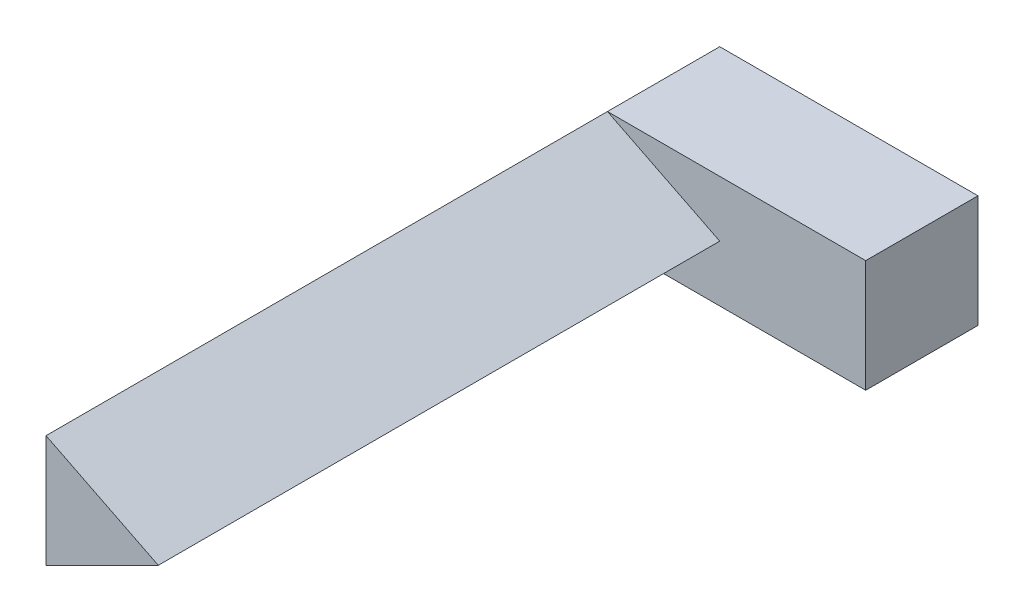
ISO-10303-21;
HEADER;
FILE_DESCRIPTION(('STEP AP214'),'2;1');
FILE_NAME('part.step','',(''),(''),'','','');
FILE_SCHEMA(('AUTOMOTIVE_DESIGN { 1 0 10303 214 1 1 1 1 }'));
ENDSEC;
DATA;
#1=APPLICATION_CONTEXT('core data for automotive mechanical design processes');
#2=APPLICATION_PROTOCOL_DEFINITION('international standard','automotive_design',2000,#1);
#3=PRODUCT_CONTEXT('',#1,'mechanical');
#4=PRODUCT('Part','Part','',(#3));
#5=PRODUCT_RELATED_PRODUCT_CATEGORY('part','',(#4));
#6=PRODUCT_DEFINITION_FORMATION('','',#4);
#7=PRODUCT_DEFINITION_CONTEXT('part definition',#1,'design');
#8=PRODUCT_DEFINITION('design','',#6,#7);
#9=PRODUCT_DEFINITION_SHAPE('','',#8);
#10=(LENGTH_UNIT() NAMED_UNIT(*) SI_UNIT(.MILLI.,.METRE.));
#11=(NAMED_UNIT(*) PLANE_ANGLE_UNIT() SI_UNIT($,.RADIAN.));
#12=(NAMED_UNIT(*) SI_UNIT($,.STERADIAN.) SOLID_ANGLE_UNIT());
#13=UNCERTAINTY_MEASURE_WITH_UNIT(LENGTH_MEASURE(1.E-05),#10,'distance_accuracy_value','');
#14=(GEOMETRIC_REPRESENTATION_CONTEXT(3) GLOBAL_UNCERTAINTY_ASSIGNED_CONTEXT((#13)) GLOBAL_UNIT_ASSIGNED_CONTEXT((#10,
#11,#12)) REPRESENTATION_CONTEXT('',''));
#15=CARTESIAN_POINT('',(0.,0.,0.));
#16=DIRECTION('',(0.,0.,1.));
#17=DIRECTION('',(1.,0.,0.));
#18=AXIS2_PLACEMENT_3D('',#15,#16,#17);
#19=CARTESIAN_POINT('',(0.,5.,0.));
#20=DIRECTION('',(-1.,0.,0.));
#21=DIRECTION('',(0.,0.,1.));
#22=AXIS2_PLACEMENT_3D('',#19,#20,#21);
#23=PLANE('',#22);
#24=DIRECTION('',(0.,0.,-1.));
#25=VECTOR('',#24,1.);
#26=CARTESIAN_POINT('',(0.,-5.,0.));
#27=LINE('',#26,#25);
#28=CARTESIAN_POINT('',(0.,-5.,10.));
#29=VERTEX_POINT('',#28);
#30=CARTESIAN_POINT('',(0.,-5.,0.));
#31=VERTEX_POINT('',#30);
#32=EDGE_CURVE('E103',#29,#31,#27,.T.);
#33=ORIENTED_EDGE('',*,*,#32,.T.);
#34=DIRECTION('',(0.,-1.,0.));
#35=VECTOR('',#34,1.);
#36=CARTESIAN_POINT('',(0.,5.,0.));
#37=LINE('',#36,#35);
#38=CARTESIAN_POINT('',(0.,5.,0.));
#39=VERTEX_POINT('',#38);
#40=EDGE_CURVE('E11',#39,#31,#37,.T.);
#41=ORIENTED_EDGE('',*,*,#40,.F.);
#42=DIRECTION('',(0.,0.,-1.));
#43=VECTOR('',#42,1.);
#44=CARTESIAN_POINT('',(0.,5.,0.));
#45=LINE('',#44,#43);
#46=CARTESIAN_POINT('',(0.,5.,10.));
#47=VERTEX_POINT('',#46);
#48=EDGE_CURVE('E105',#47,#39,#45,.T.);
#49=ORIENTED_EDGE('',*,*,#48,.F.);
#50=DIRECTION('',(0.,-1.,0.));
#51=VECTOR('',#50,1.);
#52=CARTESIAN_POINT('',(0.,5.,10.));
#53=LINE('',#52,#51);
#54=EDGE_CURVE('E135',#47,#29,#53,.T.);
#55=ORIENTED_EDGE('',*,*,#54,.T.);
#56=EDGE_LOOP('',(#33,#41,#49,#55));
#57=FACE_BOUND('',#56,.T.);
#58=ADVANCED_FACE('F39',(#57),#23,.F.);
#59=CARTESIAN_POINT('',(0.,5.,0.));
#60=DIRECTION('',(0.,0.,1.));
#61=DIRECTION('',(1.,0.,0.));
#62=AXIS2_PLACEMENT_3D('',#59,#60,#61);
#63=PLANE('',#62);
#64=DIRECTION('',(-1.,0.,0.));
#65=VECTOR('',#64,1.);
#66=CARTESIAN_POINT('',(0.,-5.,0.));
#67=LINE('',#66,#65);
#68=CARTESIAN_POINT('',(-23.,-5.,0.));
#69=VERTEX_POINT('',#68);
#70=EDGE_CURVE('E129',#31,#69,#67,.T.);
#71=ORIENTED_EDGE('',*,*,#70,.T.);
#72=DIRECTION('',(0.,-1.,0.));
#73=VECTOR('',#72,1.);
#74=CARTESIAN_POINT('',(-23.,5.,0.));
#75=LINE('',#74,#73);
#76=CARTESIAN_POINT('',(-23.,5.,0.));
#77=VERTEX_POINT('',#76);
#78=EDGE_CURVE('E47',#77,#69,#75,.T.);
#79=ORIENTED_EDGE('',*,*,#78,.F.);
#80=DIRECTION('',(-1.,0.,0.));
#81=VECTOR('',#80,1.);
#82=CARTESIAN_POINT('',(0.,5.,0.));
#83=LINE('',#82,#81);
#84=EDGE_CURVE('E81',#39,#77,#83,.T.);
#85=ORIENTED_EDGE('',*,*,#84,.F.);
#86=ORIENTED_EDGE('',*,*,#40,.T.);
#87=EDGE_LOOP('',(#71,#79,#85,#86));
#88=FACE_BOUND('',#87,.T.);
#89=ADVANCED_FACE('F174',(#88),#63,.F.);
#90=CARTESIAN_POINT('',(-23.,5.,0.));
#91=DIRECTION('',(1.,0.,0.));
#92=DIRECTION('',(0.,0.,-1.));
#93=AXIS2_PLACEMENT_3D('',#90,#91,#92);
#94=PLANE('',#93);
#95=DIRECTION('',(0.,0.,1.));
#96=VECTOR('',#95,1.);
#97=CARTESIAN_POINT('',(-23.,-5.,0.));
#98=LINE('',#97,#96);
#99=CARTESIAN_POINT('',(-23.,-5.,10.));
#100=VERTEX_POINT('',#99);
#101=EDGE_CURVE('E101',#69,#100,#98,.T.);
#102=ORIENTED_EDGE('',*,*,#101,.T.);
#103=DIRECTION('',(0.,0.,1.));
#104=VECTOR('',#103,1.);
#105=CARTESIAN_POINT('',(-23.,-5.,-1.18033988749894));
#106=LINE('',#105,#104);
#107=CARTESIAN_POINT('',(-23.,-5.,60.));
#108=VERTEX_POINT('',#107);
#109=EDGE_CURVE('E109',#100,#108,#106,.T.);
#110=ORIENTED_EDGE('',*,*,#109,.T.);
#111=DIRECTION('',(0.,-1.,0.));
#112=VECTOR('',#111,1.);
#113=CARTESIAN_POINT('',(-23.,5.,60.));
#114=LINE('',#113,#112);
#115=CARTESIAN_POINT('',(-23.,5.,60.));
#116=VERTEX_POINT('',#115);
#117=EDGE_CURVE('E138',#116,#108,#114,.T.);
#118=ORIENTED_EDGE('',*,*,#117,.F.);
#119=DIRECTION('',(0.,0.,1.));
#120=VECTOR('',#119,1.);
#121=CARTESIAN_POINT('',(-23.,5.,-1.18033988749894));
#122=LINE('',#121,#120);
#123=CARTESIAN_POINT('',(-23.,5.,9.99999999999999));
#124=VERTEX_POINT('',#123);
#125=EDGE_CURVE('E153',#124,#116,#122,.T.);
#126=ORIENTED_EDGE('',*,*,#125,.F.);
#127=DIRECTION('',(0.,0.,1.));
#128=VECTOR('',#127,1.);
#129=CARTESIAN_POINT('',(-23.,5.,0.));
#130=LINE('',#129,#128);
#131=EDGE_CURVE('E143',#77,#124,#130,.T.);
#132=ORIENTED_EDGE('',*,*,#131,.F.);
#133=ORIENTED_EDGE('',*,*,#78,.T.);
#134=EDGE_LOOP('',(#102,#110,#118,#126,#132,#133));
#135=FACE_BOUND('',#134,.T.);
#136=ADVANCED_FACE('F126',(#135),#94,.F.);
#137=CARTESIAN_POINT('',(-23.,5.,60.));
#138=DIRECTION('',(0.,0.,-1.));
#139=DIRECTION('',(-1.,0.,0.));
#140=AXIS2_PLACEMENT_3D('',#137,#138,#139);
#141=PLANE('',#140);
#142=ORIENTED_EDGE('',*,*,#117,.T.);
#143=DIRECTION('',(-0.894427190999916,-0.447213595499958,0.));
#144=VECTOR('',#143,1.);
#145=CARTESIAN_POINT('',(-2.6,5.2,60.));
#146=LINE('',#145,#144);
#147=CARTESIAN_POINT('',(-13.,0.,60.));
#148=VERTEX_POINT('',#147);
#149=EDGE_CURVE('E114',#148,#108,#146,.T.);
#150=ORIENTED_EDGE('',*,*,#149,.F.);
#151=DIRECTION('',(0.894427190999916,-0.447213595499958,0.));
#152=VECTOR('',#151,1.);
#153=CARTESIAN_POINT('',(-2.6,-5.2,60.));
#154=LINE('',#153,#152);
#155=EDGE_CURVE('E119',#116,#148,#154,.T.);
#156=ORIENTED_EDGE('',*,*,#155,.F.);
#157=EDGE_LOOP('',(#142,#150,#156));
#158=FACE_BOUND('',#157,.T.);
#159=ADVANCED_FACE('F172',(#158),#141,.F.);
#160=CARTESIAN_POINT('',(0.,5.,10.));
#161=DIRECTION('',(0.,0.,-1.));
#162=DIRECTION('',(-1.,0.,0.));
#163=AXIS2_PLACEMENT_3D('',#160,#161,#162);
#164=PLANE('',#163);
#165=DIRECTION('',(1.,0.,0.));
#166=VECTOR('',#165,1.);
#167=CARTESIAN_POINT('',(0.,-5.,10.));
#168=LINE('',#167,#166);
#169=EDGE_CURVE('E76',#100,#29,#168,.T.);
#170=ORIENTED_EDGE('',*,*,#169,.T.);
#171=ORIENTED_EDGE('',*,*,#54,.F.);
#172=DIRECTION('',(1.,0.,0.));
#173=VECTOR('',#172,1.);
#174=CARTESIAN_POINT('',(0.,5.,10.));
#175=LINE('',#174,#173);
#176=EDGE_CURVE('E54',#124,#47,#175,.T.);
#177=ORIENTED_EDGE('',*,*,#176,.F.);
#178=DIRECTION('',(0.894427190999916,-0.447213595499958,0.));
#179=VECTOR('',#178,1.);
#180=CARTESIAN_POINT('',(-2.6,-5.2,10.));
#181=LINE('',#180,#179);
#182=CARTESIAN_POINT('',(-13.,0.,10.));
#183=VERTEX_POINT('',#182);
#184=EDGE_CURVE('E122',#124,#183,#181,.T.);
#185=ORIENTED_EDGE('',*,*,#184,.T.);
#186=DIRECTION('',(-0.894427190999916,-0.447213595499958,0.));
#187=VECTOR('',#186,1.);
#188=CARTESIAN_POINT('',(-2.6,5.2,10.));
#189=LINE('',#188,#187);
#190=EDGE_CURVE('E111',#183,#100,#189,.T.);
#191=ORIENTED_EDGE('',*,*,#190,.T.);
#192=EDGE_LOOP('',(#170,#171,#177,#185,#191));
#193=FACE_BOUND('',#192,.T.);
#194=ADVANCED_FACE('F121',(#193),#164,.F.);
#195=CARTESIAN_POINT('',(0.,5.,0.));
#196=DIRECTION('',(0.,-1.,0.));
#197=DIRECTION('',(0.,0.,-1.));
#198=AXIS2_PLACEMENT_3D('',#195,#196,#197);
#199=PLANE('',#198);
#200=ORIENTED_EDGE('',*,*,#131,.T.);
#201=ORIENTED_EDGE('',*,*,#176,.T.);
#202=ORIENTED_EDGE('',*,*,#48,.T.);
#203=ORIENTED_EDGE('',*,*,#84,.T.);
#204=EDGE_LOOP('',(#200,#201,#202,#203));
#205=FACE_BOUND('',#204,.T.);
#206=ADVANCED_FACE('F173',(#205),#199,.F.);
#207=CARTESIAN_POINT('',(0.,-5.,0.));
#208=DIRECTION('',(0.,-1.,0.));
#209=DIRECTION('',(0.,0.,-1.));
#210=AXIS2_PLACEMENT_3D('',#207,#208,#209);
#211=PLANE('',#210);
#212=ORIENTED_EDGE('',*,*,#169,.F.);
#213=ORIENTED_EDGE('',*,*,#101,.F.);
#214=ORIENTED_EDGE('',*,*,#70,.F.);
#215=ORIENTED_EDGE('',*,*,#32,.F.);
#216=EDGE_LOOP('',(#212,#213,#214,#215));
#217=FACE_BOUND('',#216,.T.);
#218=ADVANCED_FACE('F99',(#217),#211,.T.);
#219=CARTESIAN_POINT('',(-2.6,-5.2,-1.18033988749894));
#220=DIRECTION('',(-0.447213595499958,-0.894427190999916,0.));
#221=DIRECTION('',(0.894427190999916,-0.447213595499958,0.));
#222=AXIS2_PLACEMENT_3D('',#219,#220,#221);
#223=PLANE('',#222);
#224=ORIENTED_EDGE('',*,*,#125,.T.);
#225=ORIENTED_EDGE('',*,*,#155,.T.);
#226=DIRECTION('',(0.,0.,1.));
#227=VECTOR('',#226,1.);
#228=CARTESIAN_POINT('',(-13.,0.,-1.18033988749894));
#229=LINE('',#228,#227);
#230=EDGE_CURVE('E158',#183,#148,#229,.T.);
#231=ORIENTED_EDGE('',*,*,#230,.F.);
#232=ORIENTED_EDGE('',*,*,#184,.F.);
#233=EDGE_LOOP('',(#224,#225,#231,#232));
#234=FACE_BOUND('',#233,.T.);
#235=ADVANCED_FACE('F170',(#234),#223,.F.);
#236=CARTESIAN_POINT('',(-2.6,5.2,-1.18033988749894));
#237=DIRECTION('',(-0.447213595499958,0.894427190999916,0.));
#238=DIRECTION('',(-0.894427190999916,-0.447213595499958,0.));
#239=AXIS2_PLACEMENT_3D('',#236,#237,#238);
#240=PLANE('',#239);
#241=ORIENTED_EDGE('',*,*,#230,.T.);
#242=ORIENTED_EDGE('',*,*,#149,.T.);
#243=ORIENTED_EDGE('',*,*,#109,.F.);
#244=ORIENTED_EDGE('',*,*,#190,.F.);
#245=EDGE_LOOP('',(#241,#242,#243,#244));
#246=FACE_BOUND('',#245,.T.);
#247=ADVANCED_FACE('F110',(#246),#240,.F.);
#248=CLOSED_SHELL('',(#58,#89,#136,#159,#194,#206,#218,#235,#247));
#249=MANIFOLD_SOLID_BREP('B2',#248);
#250=ADVANCED_BREP_SHAPE_REPRESENTATION('',(#18,#249),#14);
#251=SHAPE_DEFINITION_REPRESENTATION(#9,#250);
ENDSEC;
END-ISO-10303-21;
